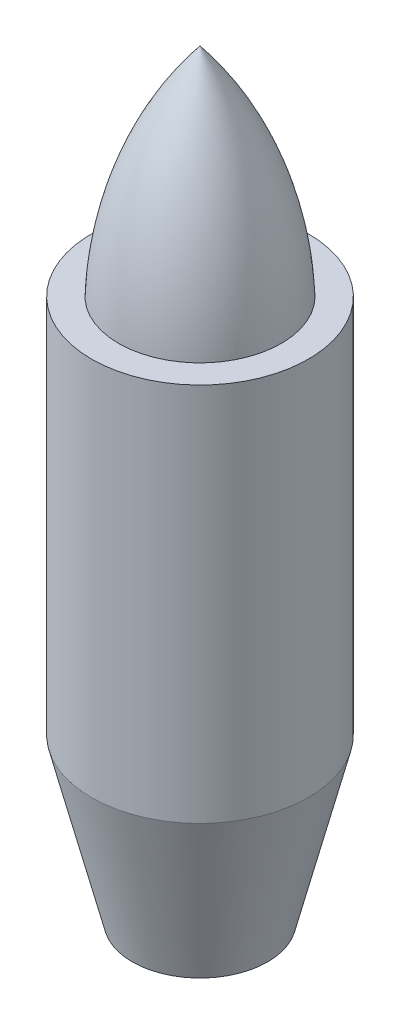
ISO-10303-21;
HEADER;
FILE_DESCRIPTION(('STEP AP214'),'2;1');
FILE_NAME('part.step','',(''),(''),'','','');
FILE_SCHEMA(('AUTOMOTIVE_DESIGN { 1 0 10303 214 1 1 1 1 }'));
ENDSEC;
DATA;
#1=APPLICATION_CONTEXT('core data for automotive mechanical design processes');
#2=APPLICATION_PROTOCOL_DEFINITION('international standard','automotive_design',2000,#1);
#3=PRODUCT_CONTEXT('',#1,'mechanical');
#4=PRODUCT('Part','Part','',(#3));
#5=PRODUCT_RELATED_PRODUCT_CATEGORY('part','',(#4));
#6=PRODUCT_DEFINITION_FORMATION('','',#4);
#7=PRODUCT_DEFINITION_CONTEXT('part definition',#1,'design');
#8=PRODUCT_DEFINITION('design','',#6,#7);
#9=PRODUCT_DEFINITION_SHAPE('','',#8);
#10=(LENGTH_UNIT() NAMED_UNIT(*) SI_UNIT(.MILLI.,.METRE.));
#11=(NAMED_UNIT(*) PLANE_ANGLE_UNIT() SI_UNIT($,.RADIAN.));
#12=(NAMED_UNIT(*) SI_UNIT($,.STERADIAN.) SOLID_ANGLE_UNIT());
#13=UNCERTAINTY_MEASURE_WITH_UNIT(LENGTH_MEASURE(1.E-05),#10,'distance_accuracy_value','');
#14=(GEOMETRIC_REPRESENTATION_CONTEXT(3) GLOBAL_UNCERTAINTY_ASSIGNED_CONTEXT((#13)) GLOBAL_UNIT_ASSIGNED_CONTEXT((#10,
#11,#12)) REPRESENTATION_CONTEXT('',''));
#15=CARTESIAN_POINT('',(0.,0.,0.));
#16=DIRECTION('',(0.,0.,1.));
#17=DIRECTION('',(1.,0.,0.));
#18=AXIS2_PLACEMENT_3D('',#15,#16,#17);
#19=CARTESIAN_POINT('',(0.,700.,0.));
#20=DIRECTION('',(0.,-1.,0.));
#21=DIRECTION('',(0.,0.,-1.));
#22=AXIS2_PLACEMENT_3D('',#19,#20,#21);
#23=CYLINDRICAL_SURFACE('',#22,200.);
#24=CARTESIAN_POINT('',(0.,700.,0.));
#25=DIRECTION('',(0.,1.,0.));
#26=DIRECTION('',(0.,0.,1.));
#27=AXIS2_PLACEMENT_3D('',#24,#25,#26);
#28=CIRCLE('',#27,200.);
#29=CARTESIAN_POINT('',(0.,700.,200.));
#30=VERTEX_POINT('',#29);
#31=EDGE_CURVE('E167',#30,#30,#28,.T.);
#32=ORIENTED_EDGE('',*,*,#31,.F.);
#33=EDGE_LOOP('',(#32));
#34=FACE_BOUND('',#33,.T.);
#35=CARTESIAN_POINT('',(0.,0.,0.));
#36=DIRECTION('',(0.,1.,0.));
#37=DIRECTION('',(0.,0.,1.));
#38=AXIS2_PLACEMENT_3D('',#35,#36,#37);
#39=CIRCLE('',#38,200.);
#40=CARTESIAN_POINT('',(0.,0.,200.));
#41=VERTEX_POINT('',#40);
#42=EDGE_CURVE('E80',#41,#41,#39,.F.);
#43=ORIENTED_EDGE('',*,*,#42,.F.);
#44=EDGE_LOOP('',(#43));
#45=FACE_BOUND('',#44,.T.);
#46=ADVANCED_FACE('F44',(#34,#45),#23,.T.);
#47=CARTESIAN_POINT('',(0.,700.,0.));
#48=DIRECTION('',(0.,1.,0.));
#49=DIRECTION('',(0.,0.,1.));
#50=AXIS2_PLACEMENT_3D('',#47,#48,#49);
#51=PLANE('',#50);
#52=CARTESIAN_POINT('',(0.,700.,0.));
#53=DIRECTION('',(0.,1.,0.));
#54=DIRECTION('',(0.,0.,1.));
#55=AXIS2_PLACEMENT_3D('',#52,#53,#54);
#56=CIRCLE('',#55,150.);
#57=CARTESIAN_POINT('',(0.,700.,150.));
#58=VERTEX_POINT('',#57);
#59=EDGE_CURVE('E62',#58,#58,#56,.T.);
#60=ORIENTED_EDGE('',*,*,#59,.F.);
#61=EDGE_LOOP('',(#60));
#62=FACE_BOUND('',#61,.T.);
#63=ORIENTED_EDGE('',*,*,#31,.T.);
#64=EDGE_LOOP('',(#63));
#65=FACE_BOUND('',#64,.T.);
#66=ADVANCED_FACE('F93',(#62,#65),#51,.T.);
#67=CARTESIAN_POINT('',(0.,-300.,0.));
#68=DIRECTION('',(0.,-1.,0.));
#69=DIRECTION('',(0.,0.,-1.));
#70=AXIS2_PLACEMENT_3D('',#67,#68,#69);
#71=PLANE('',#70);
#72=CARTESIAN_POINT('',(0.,-300.,0.));
#73=DIRECTION('',(0.,-1.,0.));
#74=DIRECTION('',(0.,0.,-1.));
#75=AXIS2_PLACEMENT_3D('',#72,#73,#74);
#76=CIRCLE('',#75,125.);
#77=CARTESIAN_POINT('',(0.,-300.,-125.));
#78=VERTEX_POINT('',#77);
#79=EDGE_CURVE('E69',#78,#78,#76,.T.);
#80=ORIENTED_EDGE('',*,*,#79,.T.);
#81=EDGE_LOOP('',(#80));
#82=FACE_BOUND('',#81,.T.);
#83=ADVANCED_FACE('F90',(#82),#71,.T.);
#84=CARTESIAN_POINT('',(0.,-300.,0.));
#85=DIRECTION('',(0.,1.,0.));
#86=DIRECTION('',(0.,0.,1.));
#87=AXIS2_PLACEMENT_3D('',#84,#85,#86);
#88=CONICAL_SURFACE('',#87,125.,0.244978663126864);
#89=ORIENTED_EDGE('',*,*,#79,.F.);
#90=EDGE_LOOP('',(#89));
#91=FACE_BOUND('',#90,.T.);
#92=ORIENTED_EDGE('',*,*,#42,.T.);
#93=EDGE_LOOP('',(#92));
#94=FACE_BOUND('',#93,.T.);
#95=ADVANCED_FACE('F58',(#91,#94),#88,.T.);
#96=CARTESIAN_POINT('',(0.,673.95599894941,-527.784002801573));
#97=DIRECTION('',(-1.,0.,0.));
#98=DIRECTION('',(0.,0.,1.));
#99=AXIS2_PLACEMENT_3D('',#96,#97,#98);
#100=CIRCLE('',#99,678.284191504156);
#101=TRIMMED_CURVE('',#100,(PARAMETER_VALUE(-0.679135012983858)),
(PARAMETER_VALUE(0.679135012983858)),.T.,.PARAMETER.);
#102=CARTESIAN_POINT('',(0.,673.95599894941,0.));
#103=DIRECTION('',(0.,1.,0.));
#104=AXIS1_PLACEMENT('',#102,#103);
#105=SURFACE_OF_REVOLUTION('',#101,#104);
#106=CARTESIAN_POINT('',(0.,1100.,0.));
#107=VERTEX_POINT('',#106);
#108=VERTEX_LOOP('',#107);
#109=FACE_BOUND('',#108,.T.);
#110=ORIENTED_EDGE('',*,*,#59,.T.);
#111=EDGE_LOOP('',(#110));
#112=FACE_BOUND('',#111,.T.);
#113=ADVANCED_FACE('F55',(#109,#112),#105,.T.);
#114=CLOSED_SHELL('',(#46,#66,#83,#95,#113));
#115=CARTESIAN_POINT('',(0.,1100.,0.));
#116=DIRECTION('',(0.,1.,0.));
#117=DIRECTION('',(0.,0.,1.));
#118=AXIS2_PLACEMENT_3D('',#115,#116,#117);
#119=CYLINDRICAL_SURFACE('',#118,10.);
#120=CARTESIAN_POINT('',(0.,700.,0.));
#121=DIRECTION('',(0.,1.,0.));
#122=DIRECTION('',(0.,0.,1.));
#123=AXIS2_PLACEMENT_3D('',#120,#121,#122);
#124=CIRCLE('',#123,10.);
#125=CARTESIAN_POINT('',(0.,700.,9.99999999999998));
#126=VERTEX_POINT('',#125);
#127=EDGE_CURVE('E12',#126,#126,#124,.T.);
#128=ORIENTED_EDGE('',*,*,#127,.T.);
#129=EDGE_LOOP('',(#128));
#130=FACE_BOUND('',#129,.T.);
#131=CARTESIAN_POINT('',(0.,1070.68276505561,0.));
#132=DIRECTION('',(0.,1.,0.));
#133=DIRECTION('',(0.,0.,1.));
#134=AXIS2_PLACEMENT_3D('',#131,#132,#133);
#135=CIRCLE('',#134,10.);
#136=CARTESIAN_POINT('',(0.,1070.68276505561,10.));
#137=VERTEX_POINT('',#136);
#138=EDGE_CURVE('E65',#137,#137,#135,.T.);
#139=ORIENTED_EDGE('',*,*,#138,.F.);
#140=EDGE_LOOP('',(#139));
#141=FACE_BOUND('',#140,.T.);
#142=ADVANCED_FACE('F110',(#130,#141),#119,.T.);
#143=CARTESIAN_POINT('',(0.,673.95599894941,0.));
#144=DIRECTION('',(0.,1.,0.));
#145=DIRECTION('',(0.,0.,1.));
#146=AXIS2_PLACEMENT_3D('',#143,#144,#145);
#147=DEGENERATE_TOROIDAL_SURFACE('',#146,527.784002801573,668.284191504156,.F.);
#148=CARTESIAN_POINT('',(0.,700.,0.));
#149=DIRECTION('',(0.,1.,0.));
#150=DIRECTION('',(0.,0.,1.));
#151=AXIS2_PLACEMENT_3D('',#148,#149,#150);
#152=CIRCLE('',#151,139.992509681188);
#153=CARTESIAN_POINT('',(0.,700.,139.992509681188));
#154=VERTEX_POINT('',#153);
#155=EDGE_CURVE('E52',#154,#154,#152,.F.);
#156=ORIENTED_EDGE('',*,*,#155,.T.);
#157=EDGE_LOOP('',(#156));
#158=FACE_BOUND('',#157,.T.);
#159=ORIENTED_EDGE('',*,*,#138,.T.);
#160=EDGE_LOOP('',(#159));
#161=FACE_BOUND('',#160,.T.);
#162=ADVANCED_FACE('F104',(#158,#161),#147,.T.);
#163=ORIENTED_EDGE('',*,*,#155,.F.);
#164=EDGE_LOOP('',(#163));
#165=FACE_BOUND('',#164,.T.);
#166=ORIENTED_EDGE('',*,*,#127,.F.);
#167=EDGE_LOOP('',(#166));
#168=FACE_BOUND('',#167,.T.);
#169=ADVANCED_FACE('F95',(#165,#168),#51,.T.);
#170=CLOSED_SHELL('',(#142,#162,#169));
#171=ORIENTED_CLOSED_SHELL('',*,#170,.T.);
#172=BREP_WITH_VOIDS('B2',#114,(#171));
#173=ADVANCED_BREP_SHAPE_REPRESENTATION('',(#18,#172),#14);
#174=SHAPE_DEFINITION_REPRESENTATION(#9,#173);
ENDSEC;
END-ISO-10303-21;
